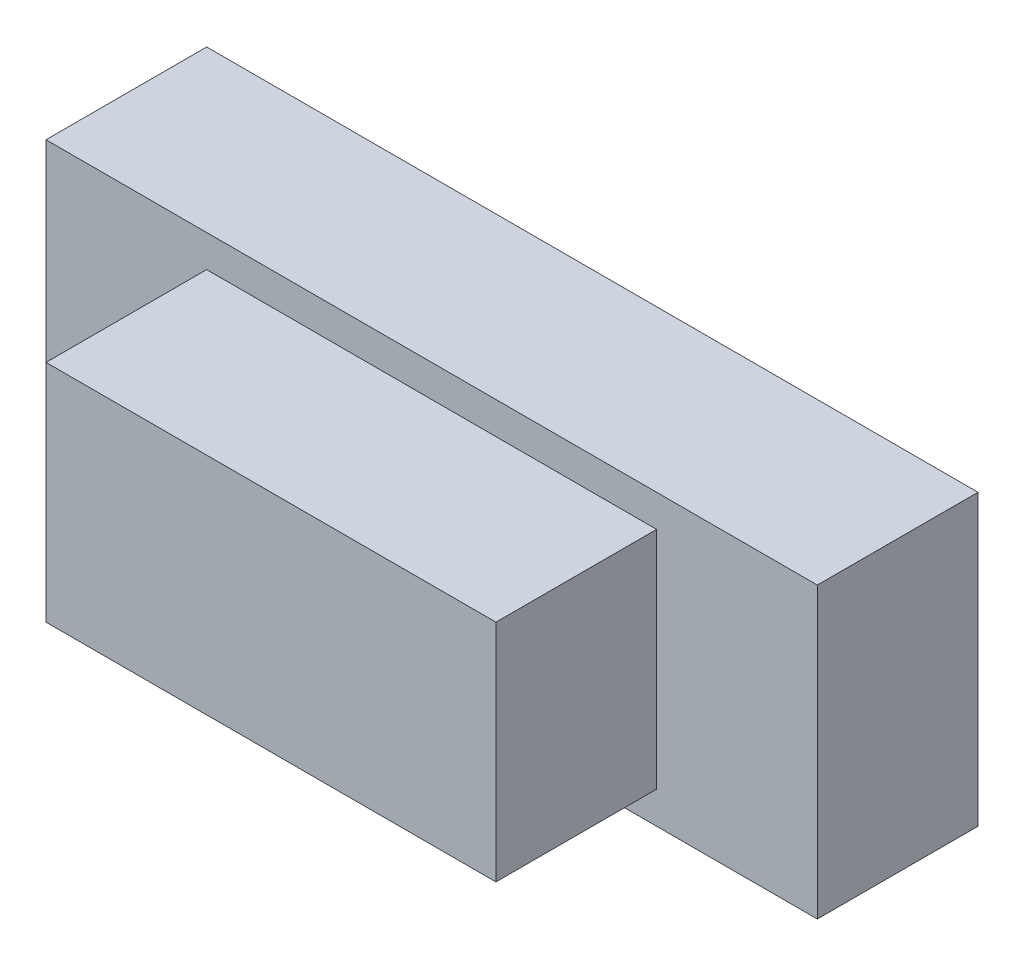
ISO-10303-21;
HEADER;
FILE_DESCRIPTION(('STEP AP214'),'2;1');
FILE_NAME('part.step','',(''),(''),'','','');
FILE_SCHEMA(('AUTOMOTIVE_DESIGN { 1 0 10303 214 1 1 1 1 }'));
ENDSEC;
DATA;
#1=APPLICATION_CONTEXT('core data for automotive mechanical design processes');
#2=APPLICATION_PROTOCOL_DEFINITION('international standard','automotive_design',2000,#1);
#3=PRODUCT_CONTEXT('',#1,'mechanical');
#4=PRODUCT('Part','Part','',(#3));
#5=PRODUCT_RELATED_PRODUCT_CATEGORY('part','',(#4));
#6=PRODUCT_DEFINITION_FORMATION('','',#4);
#7=PRODUCT_DEFINITION_CONTEXT('part definition',#1,'design');
#8=PRODUCT_DEFINITION('design','',#6,#7);
#9=PRODUCT_DEFINITION_SHAPE('','',#8);
#10=(LENGTH_UNIT() NAMED_UNIT(*) SI_UNIT(.MILLI.,.METRE.));
#11=(NAMED_UNIT(*) PLANE_ANGLE_UNIT() SI_UNIT($,.RADIAN.));
#12=(NAMED_UNIT(*) SI_UNIT($,.STERADIAN.) SOLID_ANGLE_UNIT());
#13=UNCERTAINTY_MEASURE_WITH_UNIT(LENGTH_MEASURE(1.E-05),#10,'distance_accuracy_value','');
#14=(GEOMETRIC_REPRESENTATION_CONTEXT(3) GLOBAL_UNCERTAINTY_ASSIGNED_CONTEXT((#13)) GLOBAL_UNIT_ASSIGNED_CONTEXT((#10,
#11,#12)) REPRESENTATION_CONTEXT('',''));
#15=CARTESIAN_POINT('',(0.,0.,0.));
#16=DIRECTION('',(0.,0.,1.));
#17=DIRECTION('',(1.,0.,0.));
#18=AXIS2_PLACEMENT_3D('',#15,#16,#17);
#19=CARTESIAN_POINT('',(0.,0.,12.7));
#20=DIRECTION('',(0.,0.,-1.));
#21=DIRECTION('',(-1.,0.,0.));
#22=AXIS2_PLACEMENT_3D('',#19,#20,#21);
#23=PLANE('',#22);
#24=DIRECTION('',(0.,1.,0.));
#25=VECTOR('',#24,1.);
#26=CARTESIAN_POINT('',(30.48,11.43,12.7));
#27=LINE('',#26,#25);
#28=CARTESIAN_POINT('',(30.48,-11.43,12.7));
#29=VERTEX_POINT('',#28);
#30=CARTESIAN_POINT('',(30.48,11.43,12.7));
#31=VERTEX_POINT('',#30);
#32=EDGE_CURVE('E128',#29,#31,#27,.T.);
#33=ORIENTED_EDGE('',*,*,#32,.T.);
#34=DIRECTION('',(-1.,0.,0.));
#35=VECTOR('',#34,1.);
#36=CARTESIAN_POINT('',(30.48,11.43,12.7));
#37=LINE('',#36,#35);
#38=CARTESIAN_POINT('',(-30.48,11.43,12.7));
#39=VERTEX_POINT('',#38);
#40=EDGE_CURVE('E131',#31,#39,#37,.T.);
#41=ORIENTED_EDGE('',*,*,#40,.T.);
#42=DIRECTION('',(0.,-1.,0.));
#43=VECTOR('',#42,1.);
#44=CARTESIAN_POINT('',(-30.48,11.43,12.7));
#45=LINE('',#44,#43);
#46=CARTESIAN_POINT('',(-30.48,-11.43,12.7));
#47=VERTEX_POINT('',#46);
#48=EDGE_CURVE('E134',#39,#47,#45,.T.);
#49=ORIENTED_EDGE('',*,*,#48,.T.);
#50=DIRECTION('',(1.,0.,0.));
#51=VECTOR('',#50,1.);
#52=CARTESIAN_POINT('',(30.48,-11.43,12.7));
#53=LINE('',#52,#51);
#54=EDGE_CURVE('E136',#47,#29,#53,.T.);
#55=ORIENTED_EDGE('',*,*,#54,.T.);
#56=EDGE_LOOP('',(#33,#41,#49,#55));
#57=FACE_BOUND('',#56,.T.);
#58=DIRECTION('',(0.,-1.,0.));
#59=VECTOR('',#58,1.);
#60=CARTESIAN_POINT('',(-17.78,8.89,12.7));
#61=LINE('',#60,#59);
#62=CARTESIAN_POINT('',(-17.78,8.89,12.7));
#63=VERTEX_POINT('',#62);
#64=CARTESIAN_POINT('',(-17.78,-8.89,12.7));
#65=VERTEX_POINT('',#64);
#66=EDGE_CURVE('E118',#63,#65,#61,.T.);
#67=ORIENTED_EDGE('',*,*,#66,.F.);
#68=DIRECTION('',(-1.,0.,0.));
#69=VECTOR('',#68,1.);
#70=CARTESIAN_POINT('',(17.78,8.89,12.7));
#71=LINE('',#70,#69);
#72=CARTESIAN_POINT('',(17.78,8.89,12.7));
#73=VERTEX_POINT('',#72);
#74=EDGE_CURVE('E115',#73,#63,#71,.T.);
#75=ORIENTED_EDGE('',*,*,#74,.F.);
#76=DIRECTION('',(0.,1.,0.));
#77=VECTOR('',#76,1.);
#78=CARTESIAN_POINT('',(17.78,8.89,12.7));
#79=LINE('',#78,#77);
#80=CARTESIAN_POINT('',(17.78,-8.89,12.7));
#81=VERTEX_POINT('',#80);
#82=EDGE_CURVE('E53',#81,#73,#79,.T.);
#83=ORIENTED_EDGE('',*,*,#82,.F.);
#84=DIRECTION('',(1.,0.,0.));
#85=VECTOR('',#84,1.);
#86=CARTESIAN_POINT('',(17.78,-8.89,12.7));
#87=LINE('',#86,#85);
#88=EDGE_CURVE('E48',#65,#81,#87,.T.);
#89=ORIENTED_EDGE('',*,*,#88,.F.);
#90=EDGE_LOOP('',(#67,#75,#83,#89));
#91=FACE_BOUND('',#90,.T.);
#92=ADVANCED_FACE('F33',(#57,#91),#23,.F.);
#93=CARTESIAN_POINT('',(30.48,11.43,12.7));
#94=DIRECTION('',(-1.,0.,0.));
#95=DIRECTION('',(0.,0.,1.));
#96=AXIS2_PLACEMENT_3D('',#93,#94,#95);
#97=PLANE('',#96);
#98=DIRECTION('',(0.,1.,0.));
#99=VECTOR('',#98,1.);
#100=CARTESIAN_POINT('',(30.48,11.43,0.));
#101=LINE('',#100,#99);
#102=CARTESIAN_POINT('',(30.48,-11.43,0.));
#103=VERTEX_POINT('',#102);
#104=CARTESIAN_POINT('',(30.48,11.43,0.));
#105=VERTEX_POINT('',#104);
#106=EDGE_CURVE('E119',#103,#105,#101,.T.);
#107=ORIENTED_EDGE('',*,*,#106,.T.);
#108=DIRECTION('',(0.,0.,-1.));
#109=VECTOR('',#108,1.);
#110=CARTESIAN_POINT('',(30.48,11.43,12.7));
#111=LINE('',#110,#109);
#112=EDGE_CURVE('E11',#31,#105,#111,.T.);
#113=ORIENTED_EDGE('',*,*,#112,.F.);
#114=ORIENTED_EDGE('',*,*,#32,.F.);
#115=DIRECTION('',(0.,0.,-1.));
#116=VECTOR('',#115,1.);
#117=CARTESIAN_POINT('',(30.48,-11.43,12.7));
#118=LINE('',#117,#116);
#119=EDGE_CURVE('E137',#29,#103,#118,.T.);
#120=ORIENTED_EDGE('',*,*,#119,.T.);
#121=EDGE_LOOP('',(#107,#113,#114,#120));
#122=FACE_BOUND('',#121,.T.);
#123=ADVANCED_FACE('F35',(#122),#97,.F.);
#124=CARTESIAN_POINT('',(30.48,11.43,12.7));
#125=DIRECTION('',(0.,-1.,0.));
#126=DIRECTION('',(0.,0.,-1.));
#127=AXIS2_PLACEMENT_3D('',#124,#125,#126);
#128=PLANE('',#127);
#129=DIRECTION('',(-1.,0.,0.));
#130=VECTOR('',#129,1.);
#131=CARTESIAN_POINT('',(30.48,11.43,0.));
#132=LINE('',#131,#130);
#133=CARTESIAN_POINT('',(-30.48,11.43,0.));
#134=VERTEX_POINT('',#133);
#135=EDGE_CURVE('E122',#105,#134,#132,.T.);
#136=ORIENTED_EDGE('',*,*,#135,.T.);
#137=DIRECTION('',(0.,0.,-1.));
#138=VECTOR('',#137,1.);
#139=CARTESIAN_POINT('',(-30.48,11.43,12.7));
#140=LINE('',#139,#138);
#141=EDGE_CURVE('E41',#39,#134,#140,.T.);
#142=ORIENTED_EDGE('',*,*,#141,.F.);
#143=ORIENTED_EDGE('',*,*,#40,.F.);
#144=ORIENTED_EDGE('',*,*,#112,.T.);
#145=EDGE_LOOP('',(#136,#142,#143,#144));
#146=FACE_BOUND('',#145,.T.);
#147=ADVANCED_FACE('F167',(#146),#128,.F.);
#148=CARTESIAN_POINT('',(-30.48,11.43,12.7));
#149=DIRECTION('',(1.,0.,0.));
#150=DIRECTION('',(0.,0.,-1.));
#151=AXIS2_PLACEMENT_3D('',#148,#149,#150);
#152=PLANE('',#151);
#153=DIRECTION('',(0.,-1.,0.));
#154=VECTOR('',#153,1.);
#155=CARTESIAN_POINT('',(-30.48,11.43,0.));
#156=LINE('',#155,#154);
#157=CARTESIAN_POINT('',(-30.48,-11.43,0.));
#158=VERTEX_POINT('',#157);
#159=EDGE_CURVE('E140',#134,#158,#156,.T.);
#160=ORIENTED_EDGE('',*,*,#159,.T.);
#161=DIRECTION('',(0.,0.,-1.));
#162=VECTOR('',#161,1.);
#163=CARTESIAN_POINT('',(-30.48,-11.43,12.7));
#164=LINE('',#163,#162);
#165=EDGE_CURVE('E145',#47,#158,#164,.T.);
#166=ORIENTED_EDGE('',*,*,#165,.F.);
#167=ORIENTED_EDGE('',*,*,#48,.F.);
#168=ORIENTED_EDGE('',*,*,#141,.T.);
#169=EDGE_LOOP('',(#160,#166,#167,#168));
#170=FACE_BOUND('',#169,.T.);
#171=ADVANCED_FACE('F152',(#170),#152,.F.);
#172=CARTESIAN_POINT('',(30.48,-11.43,12.7));
#173=DIRECTION('',(0.,1.,0.));
#174=DIRECTION('',(0.,0.,1.));
#175=AXIS2_PLACEMENT_3D('',#172,#173,#174);
#176=PLANE('',#175);
#177=DIRECTION('',(1.,0.,0.));
#178=VECTOR('',#177,1.);
#179=CARTESIAN_POINT('',(30.48,-11.43,0.));
#180=LINE('',#179,#178);
#181=EDGE_CURVE('E132',#158,#103,#180,.T.);
#182=ORIENTED_EDGE('',*,*,#181,.T.);
#183=ORIENTED_EDGE('',*,*,#119,.F.);
#184=ORIENTED_EDGE('',*,*,#54,.F.);
#185=ORIENTED_EDGE('',*,*,#165,.T.);
#186=EDGE_LOOP('',(#182,#183,#184,#185));
#187=FACE_BOUND('',#186,.T.);
#188=ADVANCED_FACE('F161',(#187),#176,.F.);
#189=CARTESIAN_POINT('',(0.,0.,0.));
#190=DIRECTION('',(0.,0.,-1.));
#191=DIRECTION('',(-1.,0.,0.));
#192=AXIS2_PLACEMENT_3D('',#189,#190,#191);
#193=PLANE('',#192);
#194=ORIENTED_EDGE('',*,*,#106,.F.);
#195=ORIENTED_EDGE('',*,*,#181,.F.);
#196=ORIENTED_EDGE('',*,*,#159,.F.);
#197=ORIENTED_EDGE('',*,*,#135,.F.);
#198=EDGE_LOOP('',(#194,#195,#196,#197));
#199=FACE_BOUND('',#198,.T.);
#200=ADVANCED_FACE('F158',(#199),#193,.T.);
#201=CARTESIAN_POINT('',(-17.78,8.89,25.4));
#202=DIRECTION('',(1.,0.,0.));
#203=DIRECTION('',(0.,1.,0.));
#204=AXIS2_PLACEMENT_3D('',#201,#202,#203);
#205=PLANE('',#204);
#206=ORIENTED_EDGE('',*,*,#66,.T.);
#207=DIRECTION('',(0.,0.,-1.));
#208=VECTOR('',#207,1.);
#209=CARTESIAN_POINT('',(-17.78,-8.89,25.4));
#210=LINE('',#209,#208);
#211=CARTESIAN_POINT('',(-17.78,-8.89,25.4));
#212=VERTEX_POINT('',#211);
#213=EDGE_CURVE('E99',#212,#65,#210,.T.);
#214=ORIENTED_EDGE('',*,*,#213,.F.);
#215=DIRECTION('',(0.,-1.,0.));
#216=VECTOR('',#215,1.);
#217=CARTESIAN_POINT('',(-17.78,8.89,25.4));
#218=LINE('',#217,#216);
#219=CARTESIAN_POINT('',(-17.78,8.89,25.4));
#220=VERTEX_POINT('',#219);
#221=EDGE_CURVE('E106',#220,#212,#218,.T.);
#222=ORIENTED_EDGE('',*,*,#221,.F.);
#223=DIRECTION('',(0.,0.,-1.));
#224=VECTOR('',#223,1.);
#225=CARTESIAN_POINT('',(-17.78,8.89,25.4));
#226=LINE('',#225,#224);
#227=EDGE_CURVE('E260',#220,#63,#226,.T.);
#228=ORIENTED_EDGE('',*,*,#227,.T.);
#229=EDGE_LOOP('',(#206,#214,#222,#228));
#230=FACE_BOUND('',#229,.T.);
#231=ADVANCED_FACE('F117',(#230),#205,.F.);
#232=CARTESIAN_POINT('',(17.78,-8.89,25.4));
#233=DIRECTION('',(0.,1.,0.));
#234=DIRECTION('',(-1.,0.,0.));
#235=AXIS2_PLACEMENT_3D('',#232,#233,#234);
#236=PLANE('',#235);
#237=ORIENTED_EDGE('',*,*,#88,.T.);
#238=DIRECTION('',(0.,0.,-1.));
#239=VECTOR('',#238,1.);
#240=CARTESIAN_POINT('',(17.78,-8.89,25.4));
#241=LINE('',#240,#239);
#242=CARTESIAN_POINT('',(17.78,-8.89,25.4));
#243=VERTEX_POINT('',#242);
#244=EDGE_CURVE('E102',#243,#81,#241,.T.);
#245=ORIENTED_EDGE('',*,*,#244,.F.);
#246=DIRECTION('',(1.,0.,0.));
#247=VECTOR('',#246,1.);
#248=CARTESIAN_POINT('',(17.78,-8.89,25.4));
#249=LINE('',#248,#247);
#250=EDGE_CURVE('E95',#212,#243,#249,.T.);
#251=ORIENTED_EDGE('',*,*,#250,.F.);
#252=ORIENTED_EDGE('',*,*,#213,.T.);
#253=EDGE_LOOP('',(#237,#245,#251,#252));
#254=FACE_BOUND('',#253,.T.);
#255=ADVANCED_FACE('F97',(#254),#236,.F.);
#256=CARTESIAN_POINT('',(17.78,8.89,25.4));
#257=DIRECTION('',(-1.,0.,0.));
#258=DIRECTION('',(0.,-1.,0.));
#259=AXIS2_PLACEMENT_3D('',#256,#257,#258);
#260=PLANE('',#259);
#261=ORIENTED_EDGE('',*,*,#82,.T.);
#262=DIRECTION('',(0.,0.,-1.));
#263=VECTOR('',#262,1.);
#264=CARTESIAN_POINT('',(17.78,8.89,25.4));
#265=LINE('',#264,#263);
#266=CARTESIAN_POINT('',(17.78,8.89,25.4));
#267=VERTEX_POINT('',#266);
#268=EDGE_CURVE('E124',#267,#73,#265,.T.);
#269=ORIENTED_EDGE('',*,*,#268,.F.);
#270=DIRECTION('',(0.,1.,0.));
#271=VECTOR('',#270,1.);
#272=CARTESIAN_POINT('',(17.78,8.89,25.4));
#273=LINE('',#272,#271);
#274=EDGE_CURVE('E105',#243,#267,#273,.T.);
#275=ORIENTED_EDGE('',*,*,#274,.F.);
#276=ORIENTED_EDGE('',*,*,#244,.T.);
#277=EDGE_LOOP('',(#261,#269,#275,#276));
#278=FACE_BOUND('',#277,.T.);
#279=ADVANCED_FACE('F203',(#278),#260,.F.);
#280=CARTESIAN_POINT('',(17.78,8.89,25.4));
#281=DIRECTION('',(0.,-1.,0.));
#282=DIRECTION('',(1.,0.,0.));
#283=AXIS2_PLACEMENT_3D('',#280,#281,#282);
#284=PLANE('',#283);
#285=ORIENTED_EDGE('',*,*,#74,.T.);
#286=ORIENTED_EDGE('',*,*,#227,.F.);
#287=DIRECTION('',(-1.,0.,0.));
#288=VECTOR('',#287,1.);
#289=CARTESIAN_POINT('',(17.78,8.89,25.4));
#290=LINE('',#289,#288);
#291=EDGE_CURVE('E111',#267,#220,#290,.T.);
#292=ORIENTED_EDGE('',*,*,#291,.F.);
#293=ORIENTED_EDGE('',*,*,#268,.T.);
#294=EDGE_LOOP('',(#285,#286,#292,#293));
#295=FACE_BOUND('',#294,.T.);
#296=ADVANCED_FACE('F209',(#295),#284,.F.);
#297=CARTESIAN_POINT('',(0.,0.,25.4));
#298=DIRECTION('',(0.,0.,-1.));
#299=DIRECTION('',(-1.,0.,0.));
#300=AXIS2_PLACEMENT_3D('',#297,#298,#299);
#301=PLANE('',#300);
#302=ORIENTED_EDGE('',*,*,#221,.T.);
#303=ORIENTED_EDGE('',*,*,#250,.T.);
#304=ORIENTED_EDGE('',*,*,#274,.T.);
#305=ORIENTED_EDGE('',*,*,#291,.T.);
#306=EDGE_LOOP('',(#302,#303,#304,#305));
#307=FACE_BOUND('',#306,.T.);
#308=ADVANCED_FACE('F109',(#307),#301,.F.);
#309=CLOSED_SHELL('',(#92,#123,#147,#171,#188,#200,#231,#255,#279,#296,#308));
#310=MANIFOLD_SOLID_BREP('B2',#309);
#311=ADVANCED_BREP_SHAPE_REPRESENTATION('',(#18,#310),#14);
#312=SHAPE_DEFINITION_REPRESENTATION(#9,#311);
ENDSEC;
END-ISO-10303-21;
